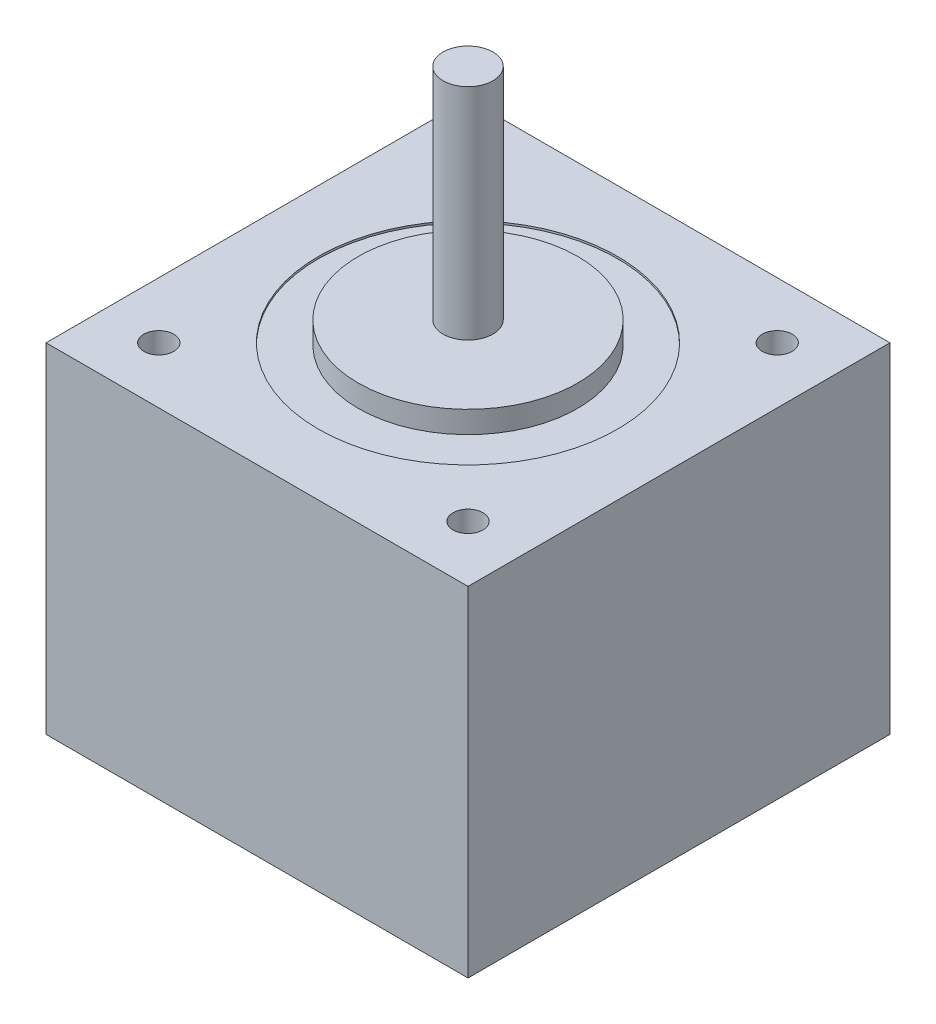
ISO-10303-21;
HEADER;
FILE_DESCRIPTION(('STEP AP214'),'2;1');
FILE_NAME('part.step','',(''),(''),'','','');
FILE_SCHEMA(('AUTOMOTIVE_DESIGN { 1 0 10303 214 1 1 1 1 }'));
ENDSEC;
DATA;
#1=APPLICATION_CONTEXT('core data for automotive mechanical design processes');
#2=APPLICATION_PROTOCOL_DEFINITION('international standard','automotive_design',2000,#1);
#3=PRODUCT_CONTEXT('',#1,'mechanical');
#4=PRODUCT('Part','Part','',(#3));
#5=PRODUCT_RELATED_PRODUCT_CATEGORY('part','',(#4));
#6=PRODUCT_DEFINITION_FORMATION('','',#4);
#7=PRODUCT_DEFINITION_CONTEXT('part definition',#1,'design');
#8=PRODUCT_DEFINITION('design','',#6,#7);
#9=PRODUCT_DEFINITION_SHAPE('','',#8);
#10=(LENGTH_UNIT() NAMED_UNIT(*) SI_UNIT(.MILLI.,.METRE.));
#11=(NAMED_UNIT(*) PLANE_ANGLE_UNIT() SI_UNIT($,.RADIAN.));
#12=(NAMED_UNIT(*) SI_UNIT($,.STERADIAN.) SOLID_ANGLE_UNIT());
#13=UNCERTAINTY_MEASURE_WITH_UNIT(LENGTH_MEASURE(1.E-05),#10,'distance_accuracy_value','');
#14=(GEOMETRIC_REPRESENTATION_CONTEXT(3) GLOBAL_UNCERTAINTY_ASSIGNED_CONTEXT((#13)) GLOBAL_UNIT_ASSIGNED_CONTEXT((#10,
#11,#12)) REPRESENTATION_CONTEXT('',''));
#15=CARTESIAN_POINT('',(0.,0.,0.));
#16=DIRECTION('',(0.,0.,1.));
#17=DIRECTION('',(1.,0.,0.));
#18=AXIS2_PLACEMENT_3D('',#15,#16,#17);
#19=CARTESIAN_POINT('',(0.,36.,0.));
#20=DIRECTION('',(0.,-1.,0.));
#21=DIRECTION('',(0.,0.,-1.));
#22=AXIS2_PLACEMENT_3D('',#19,#20,#21);
#23=CYLINDRICAL_SURFACE('',#22,11.);
#24=CARTESIAN_POINT('',(0.,36.,0.));
#25=DIRECTION('',(0.,1.,0.));
#26=DIRECTION('',(0.,0.,1.));
#27=AXIS2_PLACEMENT_3D('',#24,#25,#26);
#28=CIRCLE('',#27,11.);
#29=CARTESIAN_POINT('',(0.,36.,11.));
#30=VERTEX_POINT('',#29);
#31=EDGE_CURVE('E127',#30,#30,#28,.T.);
#32=ORIENTED_EDGE('',*,*,#31,.F.);
#33=EDGE_LOOP('',(#32));
#34=FACE_BOUND('',#33,.T.);
#35=CARTESIAN_POINT('',(0.,33.8,0.));
#36=DIRECTION('',(0.,1.,0.));
#37=DIRECTION('',(0.,0.,1.));
#38=AXIS2_PLACEMENT_3D('',#35,#36,#37);
#39=CIRCLE('',#38,11.);
#40=CARTESIAN_POINT('',(0.,33.8,11.));
#41=VERTEX_POINT('',#40);
#42=EDGE_CURVE('E150',#41,#41,#39,.T.);
#43=ORIENTED_EDGE('',*,*,#42,.T.);
#44=EDGE_LOOP('',(#43));
#45=FACE_BOUND('',#44,.T.);
#46=ADVANCED_FACE('F36',(#34,#45),#23,.T.);
#47=CARTESIAN_POINT('',(0.,36.,0.));
#48=DIRECTION('',(0.,1.,0.));
#49=DIRECTION('',(0.,0.,1.));
#50=AXIS2_PLACEMENT_3D('',#47,#48,#49);
#51=PLANE('',#50);
#52=CARTESIAN_POINT('',(0.,36.,0.));
#53=DIRECTION('',(0.,1.,0.));
#54=DIRECTION('',(0.,0.,1.));
#55=AXIS2_PLACEMENT_3D('',#52,#53,#54);
#56=CIRCLE('',#55,2.5);
#57=CARTESIAN_POINT('',(0.,36.,2.5));
#58=VERTEX_POINT('',#57);
#59=EDGE_CURVE('E11',#58,#58,#56,.T.);
#60=ORIENTED_EDGE('',*,*,#59,.F.);
#61=EDGE_LOOP('',(#60));
#62=FACE_BOUND('',#61,.T.);
#63=ORIENTED_EDGE('',*,*,#31,.T.);
#64=EDGE_LOOP('',(#63));
#65=FACE_BOUND('',#64,.T.);
#66=ADVANCED_FACE('F197',(#62,#65),#51,.T.);
#67=CARTESIAN_POINT('',(0.,58.,0.));
#68=DIRECTION('',(0.,-1.,0.));
#69=DIRECTION('',(0.,0.,-1.));
#70=AXIS2_PLACEMENT_3D('',#67,#68,#69);
#71=CYLINDRICAL_SURFACE('',#70,2.5);
#72=CARTESIAN_POINT('',(0.,58.,0.));
#73=DIRECTION('',(0.,1.,0.));
#74=DIRECTION('',(0.,0.,1.));
#75=AXIS2_PLACEMENT_3D('',#72,#73,#74);
#76=CIRCLE('',#75,2.5);
#77=CARTESIAN_POINT('',(0.,58.,2.5));
#78=VERTEX_POINT('',#77);
#79=EDGE_CURVE('E142',#78,#78,#76,.T.);
#80=ORIENTED_EDGE('',*,*,#79,.F.);
#81=EDGE_LOOP('',(#80));
#82=FACE_BOUND('',#81,.T.);
#83=ORIENTED_EDGE('',*,*,#59,.T.);
#84=EDGE_LOOP('',(#83));
#85=FACE_BOUND('',#84,.T.);
#86=ADVANCED_FACE('F203',(#82,#85),#71,.T.);
#87=CARTESIAN_POINT('',(0.,58.,0.));
#88=DIRECTION('',(0.,1.,0.));
#89=DIRECTION('',(0.,0.,1.));
#90=AXIS2_PLACEMENT_3D('',#87,#88,#89);
#91=PLANE('',#90);
#92=ORIENTED_EDGE('',*,*,#79,.T.);
#93=EDGE_LOOP('',(#92));
#94=FACE_BOUND('',#93,.T.);
#95=ADVANCED_FACE('F166',(#94),#91,.T.);
#96=CARTESIAN_POINT('',(0.,33.8,0.));
#97=DIRECTION('',(0.,1.,0.));
#98=DIRECTION('',(0.,0.,1.));
#99=AXIS2_PLACEMENT_3D('',#96,#97,#98);
#100=CYLINDRICAL_SURFACE('',#99,15.);
#101=CARTESIAN_POINT('',(0.,33.8,0.));
#102=DIRECTION('',(0.,1.,0.));
#103=DIRECTION('',(0.,0.,1.));
#104=AXIS2_PLACEMENT_3D('',#101,#102,#103);
#105=CIRCLE('',#104,15.);
#106=CARTESIAN_POINT('',(0.,33.8,15.));
#107=VERTEX_POINT('',#106);
#108=EDGE_CURVE('E146',#107,#107,#105,.T.);
#109=ORIENTED_EDGE('',*,*,#108,.F.);
#110=EDGE_LOOP('',(#109));
#111=FACE_BOUND('',#110,.T.);
#112=CARTESIAN_POINT('',(0.,34.,0.));
#113=DIRECTION('',(0.,1.,0.));
#114=DIRECTION('',(0.,0.,1.));
#115=AXIS2_PLACEMENT_3D('',#112,#113,#114);
#116=CIRCLE('',#115,15.);
#117=CARTESIAN_POINT('',(0.,34.,15.));
#118=VERTEX_POINT('',#117);
#119=EDGE_CURVE('E147',#118,#118,#116,.T.);
#120=ORIENTED_EDGE('',*,*,#119,.T.);
#121=EDGE_LOOP('',(#120));
#122=FACE_BOUND('',#121,.T.);
#123=ADVANCED_FACE('F160',(#111,#122),#100,.F.);
#124=CARTESIAN_POINT('',(0.,33.8,0.));
#125=DIRECTION('',(0.,1.,0.));
#126=DIRECTION('',(0.,0.,1.));
#127=AXIS2_PLACEMENT_3D('',#124,#125,#126);
#128=PLANE('',#127);
#129=ORIENTED_EDGE('',*,*,#42,.F.);
#130=EDGE_LOOP('',(#129));
#131=FACE_BOUND('',#130,.T.);
#132=ORIENTED_EDGE('',*,*,#108,.T.);
#133=EDGE_LOOP('',(#132));
#134=FACE_BOUND('',#133,.T.);
#135=ADVANCED_FACE('F157',(#131,#134),#128,.T.);
#136=CARTESIAN_POINT('',(0.,0.,0.));
#137=DIRECTION('',(0.,1.,0.));
#138=DIRECTION('',(0.,0.,1.));
#139=AXIS2_PLACEMENT_3D('',#136,#137,#138);
#140=PLANE('',#139);
#141=DIRECTION('',(0.,0.,-1.));
#142=VECTOR('',#141,1.);
#143=CARTESIAN_POINT('',(21.15,0.,-21.15));
#144=LINE('',#143,#142);
#145=CARTESIAN_POINT('',(21.15,0.,21.15));
#146=VERTEX_POINT('',#145);
#147=CARTESIAN_POINT('',(21.15,0.,-21.15));
#148=VERTEX_POINT('',#147);
#149=EDGE_CURVE('E103',#146,#148,#144,.T.);
#150=ORIENTED_EDGE('',*,*,#149,.F.);
#151=DIRECTION('',(1.,0.,0.));
#152=VECTOR('',#151,1.);
#153=CARTESIAN_POINT('',(-21.15,0.,21.15));
#154=LINE('',#153,#152);
#155=CARTESIAN_POINT('',(-21.15,0.,21.15));
#156=VERTEX_POINT('',#155);
#157=EDGE_CURVE('E77',#156,#146,#154,.T.);
#158=ORIENTED_EDGE('',*,*,#157,.F.);
#159=DIRECTION('',(0.,0.,1.));
#160=VECTOR('',#159,1.);
#161=CARTESIAN_POINT('',(-21.15,0.,-21.15));
#162=LINE('',#161,#160);
#163=CARTESIAN_POINT('',(-21.15,0.,-21.15));
#164=VERTEX_POINT('',#163);
#165=EDGE_CURVE('E71',#164,#156,#162,.T.);
#166=ORIENTED_EDGE('',*,*,#165,.F.);
#167=DIRECTION('',(-1.,0.,0.));
#168=VECTOR('',#167,1.);
#169=CARTESIAN_POINT('',(-21.15,0.,-21.15));
#170=LINE('',#169,#168);
#171=EDGE_CURVE('E95',#148,#164,#170,.T.);
#172=ORIENTED_EDGE('',*,*,#171,.F.);
#173=EDGE_LOOP('',(#150,#158,#166,#172));
#174=FACE_BOUND('',#173,.T.);
#175=ADVANCED_FACE('F114',(#174),#140,.F.);
#176=CARTESIAN_POINT('',(-15.5,30.,-15.5));
#177=DIRECTION('',(0.,1.,0.));
#178=DIRECTION('',(0.,0.,1.));
#179=AXIS2_PLACEMENT_3D('',#176,#177,#178);
#180=PLANE('',#179);
#181=CARTESIAN_POINT('',(-15.5,30.,-15.5));
#182=DIRECTION('',(0.,1.,0.));
#183=DIRECTION('',(0.,0.,1.));
#184=AXIS2_PLACEMENT_3D('',#181,#182,#183);
#185=CIRCLE('',#184,1.5);
#186=CARTESIAN_POINT('',(-15.5,30.,-14.));
#187=VERTEX_POINT('',#186);
#188=EDGE_CURVE('E106',#187,#187,#185,.T.);
#189=ORIENTED_EDGE('',*,*,#188,.T.);
#190=EDGE_LOOP('',(#189));
#191=FACE_BOUND('',#190,.T.);
#192=ADVANCED_FACE('F212',(#191),#180,.T.);
#193=CARTESIAN_POINT('',(15.5,30.,-15.5));
#194=DIRECTION('',(0.,1.,0.));
#195=DIRECTION('',(0.,0.,1.));
#196=AXIS2_PLACEMENT_3D('',#193,#194,#195);
#197=PLANE('',#196);
#198=CARTESIAN_POINT('',(15.5,30.,-15.5));
#199=DIRECTION('',(0.,1.,0.));
#200=DIRECTION('',(0.,0.,1.));
#201=AXIS2_PLACEMENT_3D('',#198,#199,#200);
#202=CIRCLE('',#201,1.5);
#203=CARTESIAN_POINT('',(15.5,30.,-14.));
#204=VERTEX_POINT('',#203);
#205=EDGE_CURVE('E120',#204,#204,#202,.T.);
#206=ORIENTED_EDGE('',*,*,#205,.T.);
#207=EDGE_LOOP('',(#206));
#208=FACE_BOUND('',#207,.T.);
#209=ADVANCED_FACE('F209',(#208),#197,.T.);
#210=CARTESIAN_POINT('',(15.5,30.,15.5));
#211=DIRECTION('',(0.,1.,0.));
#212=DIRECTION('',(0.,0.,1.));
#213=AXIS2_PLACEMENT_3D('',#210,#211,#212);
#214=PLANE('',#213);
#215=CARTESIAN_POINT('',(15.5,30.,15.5));
#216=DIRECTION('',(0.,1.,0.));
#217=DIRECTION('',(0.,0.,1.));
#218=AXIS2_PLACEMENT_3D('',#215,#216,#217);
#219=CIRCLE('',#218,1.5);
#220=CARTESIAN_POINT('',(15.5,30.,17.));
#221=VERTEX_POINT('',#220);
#222=EDGE_CURVE('E133',#221,#221,#219,.T.);
#223=ORIENTED_EDGE('',*,*,#222,.T.);
#224=EDGE_LOOP('',(#223));
#225=FACE_BOUND('',#224,.T.);
#226=ADVANCED_FACE('F211',(#225),#214,.T.);
#227=CARTESIAN_POINT('',(-15.5,30.,15.5));
#228=DIRECTION('',(0.,1.,0.));
#229=DIRECTION('',(0.,0.,1.));
#230=AXIS2_PLACEMENT_3D('',#227,#228,#229);
#231=PLANE('',#230);
#232=CARTESIAN_POINT('',(-15.5,30.,15.5));
#233=DIRECTION('',(0.,1.,0.));
#234=DIRECTION('',(0.,0.,1.));
#235=AXIS2_PLACEMENT_3D('',#232,#233,#234);
#236=CIRCLE('',#235,1.5);
#237=CARTESIAN_POINT('',(-15.5,30.,17.));
#238=VERTEX_POINT('',#237);
#239=EDGE_CURVE('E126',#238,#238,#236,.T.);
#240=ORIENTED_EDGE('',*,*,#239,.T.);
#241=EDGE_LOOP('',(#240));
#242=FACE_BOUND('',#241,.T.);
#243=ADVANCED_FACE('F217',(#242),#231,.T.);
#244=CARTESIAN_POINT('',(-21.15,34.,21.15));
#245=DIRECTION('',(0.,0.,-1.));
#246=DIRECTION('',(-1.,0.,0.));
#247=AXIS2_PLACEMENT_3D('',#244,#245,#246);
#248=PLANE('',#247);
#249=ORIENTED_EDGE('',*,*,#157,.T.);
#250=DIRECTION('',(0.,-1.,0.));
#251=VECTOR('',#250,1.);
#252=CARTESIAN_POINT('',(21.15,34.,21.15));
#253=LINE('',#252,#251);
#254=CARTESIAN_POINT('',(21.15,34.,21.15));
#255=VERTEX_POINT('',#254);
#256=EDGE_CURVE('E99',#255,#146,#253,.T.);
#257=ORIENTED_EDGE('',*,*,#256,.F.);
#258=DIRECTION('',(1.,0.,0.));
#259=VECTOR('',#258,1.);
#260=CARTESIAN_POINT('',(-21.15,34.,21.15));
#261=LINE('',#260,#259);
#262=CARTESIAN_POINT('',(-21.15,34.,21.15));
#263=VERTEX_POINT('',#262);
#264=EDGE_CURVE('E54',#263,#255,#261,.T.);
#265=ORIENTED_EDGE('',*,*,#264,.F.);
#266=DIRECTION('',(0.,-1.,0.));
#267=VECTOR('',#266,1.);
#268=CARTESIAN_POINT('',(-21.15,34.,21.15));
#269=LINE('',#268,#267);
#270=EDGE_CURVE('E96',#263,#156,#269,.T.);
#271=ORIENTED_EDGE('',*,*,#270,.T.);
#272=EDGE_LOOP('',(#249,#257,#265,#271));
#273=FACE_BOUND('',#272,.T.);
#274=ADVANCED_FACE('F111',(#273),#248,.F.);
#275=CARTESIAN_POINT('',(-21.15,34.,-21.15));
#276=DIRECTION('',(1.,0.,0.));
#277=DIRECTION('',(0.,0.,-1.));
#278=AXIS2_PLACEMENT_3D('',#275,#276,#277);
#279=PLANE('',#278);
#280=ORIENTED_EDGE('',*,*,#165,.T.);
#281=ORIENTED_EDGE('',*,*,#270,.F.);
#282=DIRECTION('',(0.,0.,1.));
#283=VECTOR('',#282,1.);
#284=CARTESIAN_POINT('',(-21.15,34.,-21.15));
#285=LINE('',#284,#283);
#286=CARTESIAN_POINT('',(-21.15,34.,-21.15));
#287=VERTEX_POINT('',#286);
#288=EDGE_CURVE('E88',#287,#263,#285,.T.);
#289=ORIENTED_EDGE('',*,*,#288,.F.);
#290=DIRECTION('',(0.,-1.,0.));
#291=VECTOR('',#290,1.);
#292=CARTESIAN_POINT('',(-21.15,34.,-21.15));
#293=LINE('',#292,#291);
#294=EDGE_CURVE('E93',#287,#164,#293,.T.);
#295=ORIENTED_EDGE('',*,*,#294,.T.);
#296=EDGE_LOOP('',(#280,#281,#289,#295));
#297=FACE_BOUND('',#296,.T.);
#298=ADVANCED_FACE('F97',(#297),#279,.F.);
#299=CARTESIAN_POINT('',(-21.15,34.,-21.15));
#300=DIRECTION('',(0.,0.,1.));
#301=DIRECTION('',(1.,0.,0.));
#302=AXIS2_PLACEMENT_3D('',#299,#300,#301);
#303=PLANE('',#302);
#304=ORIENTED_EDGE('',*,*,#171,.T.);
#305=ORIENTED_EDGE('',*,*,#294,.F.);
#306=DIRECTION('',(-1.,0.,0.));
#307=VECTOR('',#306,1.);
#308=CARTESIAN_POINT('',(-21.15,34.,-21.15));
#309=LINE('',#308,#307);
#310=CARTESIAN_POINT('',(21.15,34.,-21.15));
#311=VERTEX_POINT('',#310);
#312=EDGE_CURVE('E85',#311,#287,#309,.T.);
#313=ORIENTED_EDGE('',*,*,#312,.F.);
#314=DIRECTION('',(0.,-1.,0.));
#315=VECTOR('',#314,1.);
#316=CARTESIAN_POINT('',(21.15,34.,-21.15));
#317=LINE('',#316,#315);
#318=EDGE_CURVE('E40',#311,#148,#317,.T.);
#319=ORIENTED_EDGE('',*,*,#318,.T.);
#320=EDGE_LOOP('',(#304,#305,#313,#319));
#321=FACE_BOUND('',#320,.T.);
#322=ADVANCED_FACE('F94',(#321),#303,.F.);
#323=CARTESIAN_POINT('',(21.15,34.,-21.15));
#324=DIRECTION('',(-1.,0.,0.));
#325=DIRECTION('',(0.,0.,1.));
#326=AXIS2_PLACEMENT_3D('',#323,#324,#325);
#327=PLANE('',#326);
#328=ORIENTED_EDGE('',*,*,#149,.T.);
#329=ORIENTED_EDGE('',*,*,#318,.F.);
#330=DIRECTION('',(0.,0.,-1.));
#331=VECTOR('',#330,1.);
#332=CARTESIAN_POINT('',(21.15,34.,-21.15));
#333=LINE('',#332,#331);
#334=EDGE_CURVE('E90',#255,#311,#333,.T.);
#335=ORIENTED_EDGE('',*,*,#334,.F.);
#336=ORIENTED_EDGE('',*,*,#256,.T.);
#337=EDGE_LOOP('',(#328,#329,#335,#336));
#338=FACE_BOUND('',#337,.T.);
#339=ADVANCED_FACE('F38',(#338),#327,.F.);
#340=CARTESIAN_POINT('',(-15.5,30.,-15.5));
#341=DIRECTION('',(0.,1.,0.));
#342=DIRECTION('',(0.,0.,1.));
#343=AXIS2_PLACEMENT_3D('',#340,#341,#342);
#344=CYLINDRICAL_SURFACE('',#343,1.5);
#345=ORIENTED_EDGE('',*,*,#188,.F.);
#346=EDGE_LOOP('',(#345));
#347=FACE_BOUND('',#346,.T.);
#348=CARTESIAN_POINT('',(-15.5,34.,-15.5));
#349=DIRECTION('',(0.,1.,0.));
#350=DIRECTION('',(0.,0.,1.));
#351=AXIS2_PLACEMENT_3D('',#348,#349,#350);
#352=CIRCLE('',#351,1.5);
#353=CARTESIAN_POINT('',(-15.5,34.,-14.));
#354=VERTEX_POINT('',#353);
#355=EDGE_CURVE('E117',#354,#354,#352,.T.);
#356=ORIENTED_EDGE('',*,*,#355,.T.);
#357=EDGE_LOOP('',(#356));
#358=FACE_BOUND('',#357,.T.);
#359=ADVANCED_FACE('F182',(#347,#358),#344,.F.);
#360=CARTESIAN_POINT('',(15.5,30.,-15.5));
#361=DIRECTION('',(0.,1.,0.));
#362=DIRECTION('',(0.,0.,1.));
#363=AXIS2_PLACEMENT_3D('',#360,#361,#362);
#364=CYLINDRICAL_SURFACE('',#363,1.5);
#365=ORIENTED_EDGE('',*,*,#205,.F.);
#366=EDGE_LOOP('',(#365));
#367=FACE_BOUND('',#366,.T.);
#368=CARTESIAN_POINT('',(15.5,34.,-15.5));
#369=DIRECTION('',(0.,1.,0.));
#370=DIRECTION('',(0.,0.,1.));
#371=AXIS2_PLACEMENT_3D('',#368,#369,#370);
#372=CIRCLE('',#371,1.5);
#373=CARTESIAN_POINT('',(15.5,34.,-14.));
#374=VERTEX_POINT('',#373);
#375=EDGE_CURVE('E136',#374,#374,#372,.T.);
#376=ORIENTED_EDGE('',*,*,#375,.T.);
#377=EDGE_LOOP('',(#376));
#378=FACE_BOUND('',#377,.T.);
#379=ADVANCED_FACE('F184',(#367,#378),#364,.F.);
#380=CARTESIAN_POINT('',(15.5,30.,15.5));
#381=DIRECTION('',(0.,1.,0.));
#382=DIRECTION('',(0.,0.,1.));
#383=AXIS2_PLACEMENT_3D('',#380,#381,#382);
#384=CYLINDRICAL_SURFACE('',#383,1.5);
#385=ORIENTED_EDGE('',*,*,#222,.F.);
#386=EDGE_LOOP('',(#385));
#387=FACE_BOUND('',#386,.T.);
#388=CARTESIAN_POINT('',(15.5,34.,15.5));
#389=DIRECTION('',(0.,1.,0.));
#390=DIRECTION('',(0.,0.,1.));
#391=AXIS2_PLACEMENT_3D('',#388,#389,#390);
#392=CIRCLE('',#391,1.5);
#393=CARTESIAN_POINT('',(15.5,34.,17.));
#394=VERTEX_POINT('',#393);
#395=EDGE_CURVE('E130',#394,#394,#392,.T.);
#396=ORIENTED_EDGE('',*,*,#395,.T.);
#397=EDGE_LOOP('',(#396));
#398=FACE_BOUND('',#397,.T.);
#399=ADVANCED_FACE('F191',(#387,#398),#384,.F.);
#400=CARTESIAN_POINT('',(-15.5,30.,15.5));
#401=DIRECTION('',(0.,1.,0.));
#402=DIRECTION('',(0.,0.,1.));
#403=AXIS2_PLACEMENT_3D('',#400,#401,#402);
#404=CYLINDRICAL_SURFACE('',#403,1.5);
#405=ORIENTED_EDGE('',*,*,#239,.F.);
#406=EDGE_LOOP('',(#405));
#407=FACE_BOUND('',#406,.T.);
#408=CARTESIAN_POINT('',(-15.5,34.,15.5));
#409=DIRECTION('',(0.,1.,0.));
#410=DIRECTION('',(0.,0.,1.));
#411=AXIS2_PLACEMENT_3D('',#408,#409,#410);
#412=CIRCLE('',#411,1.5);
#413=CARTESIAN_POINT('',(-15.5,34.,17.));
#414=VERTEX_POINT('',#413);
#415=EDGE_CURVE('E123',#414,#414,#412,.T.);
#416=ORIENTED_EDGE('',*,*,#415,.T.);
#417=EDGE_LOOP('',(#416));
#418=FACE_BOUND('',#417,.T.);
#419=ADVANCED_FACE('F172',(#407,#418),#404,.F.);
#420=CARTESIAN_POINT('',(0.,34.,0.));
#421=DIRECTION('',(0.,1.,0.));
#422=DIRECTION('',(0.,0.,1.));
#423=AXIS2_PLACEMENT_3D('',#420,#421,#422);
#424=PLANE('',#423);
#425=ORIENTED_EDGE('',*,*,#119,.F.);
#426=EDGE_LOOP('',(#425));
#427=FACE_BOUND('',#426,.T.);
#428=ORIENTED_EDGE('',*,*,#415,.F.);
#429=EDGE_LOOP('',(#428));
#430=FACE_BOUND('',#429,.T.);
#431=ORIENTED_EDGE('',*,*,#395,.F.);
#432=EDGE_LOOP('',(#431));
#433=FACE_BOUND('',#432,.T.);
#434=ORIENTED_EDGE('',*,*,#375,.F.);
#435=EDGE_LOOP('',(#434));
#436=FACE_BOUND('',#435,.T.);
#437=ORIENTED_EDGE('',*,*,#355,.F.);
#438=EDGE_LOOP('',(#437));
#439=FACE_BOUND('',#438,.T.);
#440=ORIENTED_EDGE('',*,*,#334,.T.);
#441=ORIENTED_EDGE('',*,*,#312,.T.);
#442=ORIENTED_EDGE('',*,*,#288,.T.);
#443=ORIENTED_EDGE('',*,*,#264,.T.);
#444=EDGE_LOOP('',(#440,#441,#442,#443));
#445=FACE_BOUND('',#444,.T.);
#446=ADVANCED_FACE('F86',(#427,#430,#433,#436,#439,#445),#424,.T.);
#447=CLOSED_SHELL('',(#46,#66,#86,#95,#123,#135,#175,#192,#209,#226,#243,#274,#298,#322,#339,
#359,#379,#399,#419,#446));
#448=MANIFOLD_SOLID_BREP('B2',#447);
#449=ADVANCED_BREP_SHAPE_REPRESENTATION('',(#18,#448),#14);
#450=SHAPE_DEFINITION_REPRESENTATION(#9,#449);
ENDSEC;
END-ISO-10303-21;
